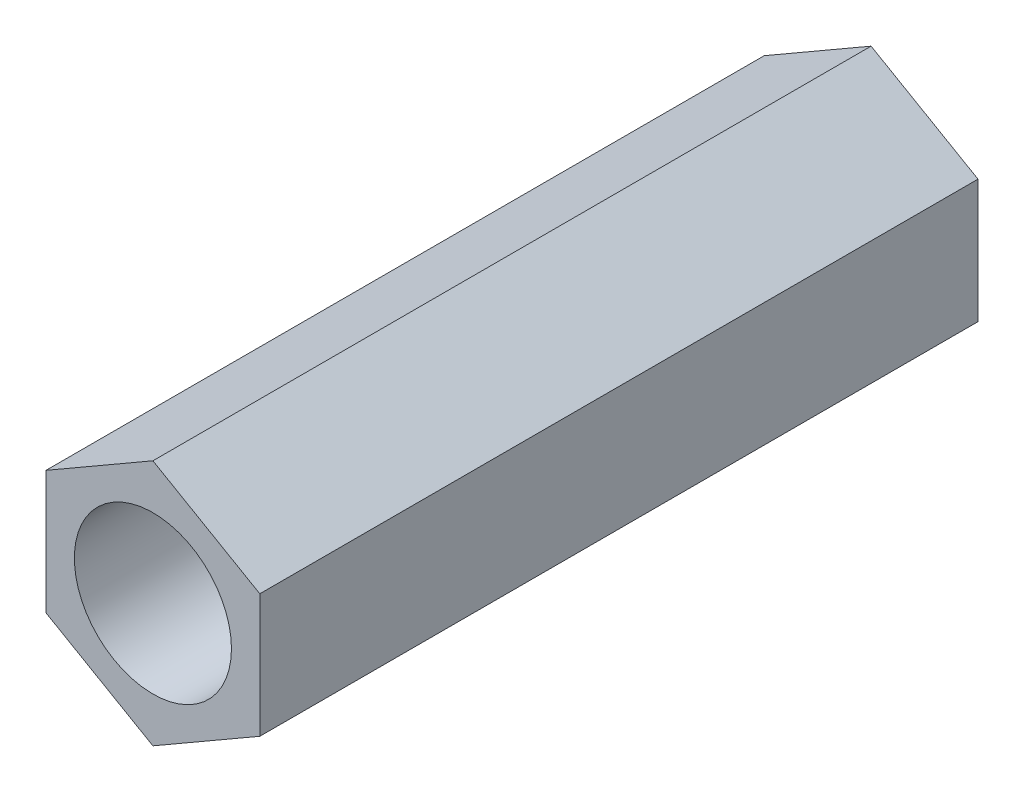
ISO-10303-21;
HEADER;
FILE_DESCRIPTION(('STEP AP214'),'2;1');
FILE_NAME('part.step','',(''),(''),'','','');
FILE_SCHEMA(('AUTOMOTIVE_DESIGN { 1 0 10303 214 1 1 1 1 }'));
ENDSEC;
DATA;
#1=APPLICATION_CONTEXT('core data for automotive mechanical design processes');
#2=APPLICATION_PROTOCOL_DEFINITION('international standard','automotive_design',2000,#1);
#3=PRODUCT_CONTEXT('',#1,'mechanical');
#4=PRODUCT('Part','Part','',(#3));
#5=PRODUCT_RELATED_PRODUCT_CATEGORY('part','',(#4));
#6=PRODUCT_DEFINITION_FORMATION('','',#4);
#7=PRODUCT_DEFINITION_CONTEXT('part definition',#1,'design');
#8=PRODUCT_DEFINITION('design','',#6,#7);
#9=PRODUCT_DEFINITION_SHAPE('','',#8);
#10=(LENGTH_UNIT() NAMED_UNIT(*) SI_UNIT(.MILLI.,.METRE.));
#11=(NAMED_UNIT(*) PLANE_ANGLE_UNIT() SI_UNIT($,.RADIAN.));
#12=(NAMED_UNIT(*) SI_UNIT($,.STERADIAN.) SOLID_ANGLE_UNIT());
#13=UNCERTAINTY_MEASURE_WITH_UNIT(LENGTH_MEASURE(1.E-05),#10,'distance_accuracy_value','');
#14=(GEOMETRIC_REPRESENTATION_CONTEXT(3) GLOBAL_UNCERTAINTY_ASSIGNED_CONTEXT((#13)) GLOBAL_UNIT_ASSIGNED_CONTEXT((#10,
#11,#12)) REPRESENTATION_CONTEXT('',''));
#15=CARTESIAN_POINT('',(0.,0.,0.));
#16=DIRECTION('',(0.,0.,1.));
#17=DIRECTION('',(1.,0.,0.));
#18=AXIS2_PLACEMENT_3D('',#15,#16,#17);
#19=CARTESIAN_POINT('',(2.38156986040719,1.37500000000003,16.));
#20=DIRECTION('',(-0.499999999999995,-0.866025403784442,0.));
#21=DIRECTION('',(0.866025403784442,-0.499999999999995,0.));
#22=AXIS2_PLACEMENT_3D('',#19,#20,#21);
#23=PLANE('',#22);
#24=DIRECTION('',(-0.866025403784442,0.499999999999995,0.));
#25=VECTOR('',#24,1.);
#26=CARTESIAN_POINT('',(2.38156986040719,1.37500000000003,0.));
#27=LINE('',#26,#25);
#28=CARTESIAN_POINT('',(2.38156986040719,1.37500000000003,0.));
#29=VERTEX_POINT('',#28);
#30=CARTESIAN_POINT('',(0.,2.75,0.));
#31=VERTEX_POINT('',#30);
#32=EDGE_CURVE('E115',#29,#31,#27,.T.);
#33=ORIENTED_EDGE('',*,*,#32,.T.);
#34=DIRECTION('',(0.,0.,-1.));
#35=VECTOR('',#34,1.);
#36=CARTESIAN_POINT('',(0.,2.75,16.));
#37=LINE('',#36,#35);
#38=CARTESIAN_POINT('',(0.,2.75,16.));
#39=VERTEX_POINT('',#38);
#40=EDGE_CURVE('E11',#39,#31,#37,.T.);
#41=ORIENTED_EDGE('',*,*,#40,.F.);
#42=DIRECTION('',(-0.866025403784442,0.499999999999995,0.));
#43=VECTOR('',#42,1.);
#44=CARTESIAN_POINT('',(2.38156986040719,1.37500000000003,16.));
#45=LINE('',#44,#43);
#46=CARTESIAN_POINT('',(2.38156986040719,1.37500000000003,16.));
#47=VERTEX_POINT('',#46);
#48=EDGE_CURVE('E126',#47,#39,#45,.T.);
#49=ORIENTED_EDGE('',*,*,#48,.F.);
#50=DIRECTION('',(0.,0.,-1.));
#51=VECTOR('',#50,1.);
#52=CARTESIAN_POINT('',(2.38156986040719,1.37500000000003,16.));
#53=LINE('',#52,#51);
#54=EDGE_CURVE('E111',#47,#29,#53,.T.);
#55=ORIENTED_EDGE('',*,*,#54,.T.);
#56=EDGE_LOOP('',(#33,#41,#49,#55));
#57=FACE_BOUND('',#56,.T.);
#58=ADVANCED_FACE('F31',(#57),#23,.F.);
#59=CARTESIAN_POINT('',(0.,2.75,16.));
#60=DIRECTION('',(0.500000000000001,-0.866025403784438,0.));
#61=DIRECTION('',(0.866025403784438,0.500000000000001,0.));
#62=AXIS2_PLACEMENT_3D('',#59,#60,#61);
#63=PLANE('',#62);
#64=DIRECTION('',(-0.866025403784438,-0.500000000000001,0.));
#65=VECTOR('',#64,1.);
#66=CARTESIAN_POINT('',(0.,2.75,0.));
#67=LINE('',#66,#65);
#68=CARTESIAN_POINT('',(-2.38156986040721,1.37499999999999,0.));
#69=VERTEX_POINT('',#68);
#70=EDGE_CURVE('E118',#31,#69,#67,.T.);
#71=ORIENTED_EDGE('',*,*,#70,.T.);
#72=DIRECTION('',(0.,0.,-1.));
#73=VECTOR('',#72,1.);
#74=CARTESIAN_POINT('',(-2.38156986040721,1.37499999999999,16.));
#75=LINE('',#74,#73);
#76=CARTESIAN_POINT('',(-2.38156986040721,1.37499999999999,16.));
#77=VERTEX_POINT('',#76);
#78=EDGE_CURVE('E39',#77,#69,#75,.T.);
#79=ORIENTED_EDGE('',*,*,#78,.F.);
#80=DIRECTION('',(-0.866025403784438,-0.500000000000001,0.));
#81=VECTOR('',#80,1.);
#82=CARTESIAN_POINT('',(0.,2.75,16.));
#83=LINE('',#82,#81);
#84=EDGE_CURVE('E84',#39,#77,#83,.T.);
#85=ORIENTED_EDGE('',*,*,#84,.F.);
#86=ORIENTED_EDGE('',*,*,#40,.T.);
#87=EDGE_LOOP('',(#71,#79,#85,#86));
#88=FACE_BOUND('',#87,.T.);
#89=ADVANCED_FACE('F151',(#88),#63,.F.);
#90=CARTESIAN_POINT('',(-2.38156986040721,1.37499999999999,16.));
#91=DIRECTION('',(1.,0.,0.));
#92=DIRECTION('',(0.,1.,0.));
#93=AXIS2_PLACEMENT_3D('',#90,#91,#92);
#94=PLANE('',#93);
#95=DIRECTION('',(0.,-1.,0.));
#96=VECTOR('',#95,1.);
#97=CARTESIAN_POINT('',(-2.38156986040721,1.37499999999999,0.));
#98=LINE('',#97,#96);
#99=CARTESIAN_POINT('',(-2.3815698604072,-1.37500000000001,0.));
#100=VERTEX_POINT('',#99);
#101=EDGE_CURVE('E121',#69,#100,#98,.T.);
#102=ORIENTED_EDGE('',*,*,#101,.T.);
#103=DIRECTION('',(0.,0.,-1.));
#104=VECTOR('',#103,1.);
#105=CARTESIAN_POINT('',(-2.3815698604072,-1.37500000000001,16.));
#106=LINE('',#105,#104);
#107=CARTESIAN_POINT('',(-2.3815698604072,-1.37500000000001,16.));
#108=VERTEX_POINT('',#107);
#109=EDGE_CURVE('E106',#108,#100,#106,.T.);
#110=ORIENTED_EDGE('',*,*,#109,.F.);
#111=DIRECTION('',(0.,-1.,0.));
#112=VECTOR('',#111,1.);
#113=CARTESIAN_POINT('',(-2.38156986040721,1.37499999999999,16.));
#114=LINE('',#113,#112);
#115=EDGE_CURVE('E97',#77,#108,#114,.T.);
#116=ORIENTED_EDGE('',*,*,#115,.F.);
#117=ORIENTED_EDGE('',*,*,#78,.T.);
#118=EDGE_LOOP('',(#102,#110,#116,#117));
#119=FACE_BOUND('',#118,.T.);
#120=ADVANCED_FACE('F132',(#119),#94,.F.);
#121=CARTESIAN_POINT('',(-2.3815698604072,-1.37500000000001,16.));
#122=DIRECTION('',(0.499999999999995,0.866025403784441,0.));
#123=DIRECTION('',(-0.866025403784442,0.499999999999995,0.));
#124=AXIS2_PLACEMENT_3D('',#121,#122,#123);
#125=PLANE('',#124);
#126=DIRECTION('',(0.866025403784441,-0.499999999999995,0.));
#127=VECTOR('',#126,1.);
#128=CARTESIAN_POINT('',(-2.3815698604072,-1.37500000000001,0.));
#129=LINE('',#128,#127);
#130=CARTESIAN_POINT('',(0.,-2.75,0.));
#131=VERTEX_POINT('',#130);
#132=EDGE_CURVE('E105',#100,#131,#129,.T.);
#133=ORIENTED_EDGE('',*,*,#132,.T.);
#134=DIRECTION('',(0.,0.,-1.));
#135=VECTOR('',#134,1.);
#136=CARTESIAN_POINT('',(0.,-2.75,16.));
#137=LINE('',#136,#135);
#138=CARTESIAN_POINT('',(0.,-2.75,16.));
#139=VERTEX_POINT('',#138);
#140=EDGE_CURVE('E102',#139,#131,#137,.T.);
#141=ORIENTED_EDGE('',*,*,#140,.F.);
#142=DIRECTION('',(0.866025403784441,-0.499999999999995,0.));
#143=VECTOR('',#142,1.);
#144=CARTESIAN_POINT('',(-2.3815698604072,-1.37500000000001,16.));
#145=LINE('',#144,#143);
#146=EDGE_CURVE('E91',#108,#139,#145,.T.);
#147=ORIENTED_EDGE('',*,*,#146,.F.);
#148=ORIENTED_EDGE('',*,*,#109,.T.);
#149=EDGE_LOOP('',(#133,#141,#147,#148));
#150=FACE_BOUND('',#149,.T.);
#151=ADVANCED_FACE('F103',(#150),#125,.F.);
#152=CARTESIAN_POINT('',(0.,-2.75,16.));
#153=DIRECTION('',(-0.500000000000007,0.866025403784435,0.));
#154=DIRECTION('',(-0.866025403784434,-0.500000000000007,0.));
#155=AXIS2_PLACEMENT_3D('',#152,#153,#154);
#156=PLANE('',#155);
#157=DIRECTION('',(0.866025403784434,0.500000000000007,0.));
#158=VECTOR('',#157,1.);
#159=CARTESIAN_POINT('',(0.,-2.75,0.));
#160=LINE('',#159,#158);
#161=CARTESIAN_POINT('',(2.38156986040722,-1.37499999999998,0.));
#162=VERTEX_POINT('',#161);
#163=EDGE_CURVE('E70',#131,#162,#160,.T.);
#164=ORIENTED_EDGE('',*,*,#163,.T.);
#165=DIRECTION('',(0.,0.,-1.));
#166=VECTOR('',#165,1.);
#167=CARTESIAN_POINT('',(2.38156986040722,-1.37499999999998,16.));
#168=LINE('',#167,#166);
#169=CARTESIAN_POINT('',(2.38156986040722,-1.37499999999998,16.));
#170=VERTEX_POINT('',#169);
#171=EDGE_CURVE('E107',#170,#162,#168,.T.);
#172=ORIENTED_EDGE('',*,*,#171,.F.);
#173=DIRECTION('',(0.866025403784434,0.500000000000007,0.));
#174=VECTOR('',#173,1.);
#175=CARTESIAN_POINT('',(0.,-2.75,16.));
#176=LINE('',#175,#174);
#177=EDGE_CURVE('E95',#139,#170,#176,.T.);
#178=ORIENTED_EDGE('',*,*,#177,.F.);
#179=ORIENTED_EDGE('',*,*,#140,.T.);
#180=EDGE_LOOP('',(#164,#172,#178,#179));
#181=FACE_BOUND('',#180,.T.);
#182=ADVANCED_FACE('F109',(#181),#156,.F.);
#183=CARTESIAN_POINT('',(2.38156986040722,-1.37499999999998,16.));
#184=DIRECTION('',(-1.,0.,0.));
#185=DIRECTION('',(0.,-1.,0.));
#186=AXIS2_PLACEMENT_3D('',#183,#184,#185);
#187=PLANE('',#186);
#188=DIRECTION('',(0.,1.,0.));
#189=VECTOR('',#188,1.);
#190=CARTESIAN_POINT('',(2.38156986040722,-1.37499999999998,0.));
#191=LINE('',#190,#189);
#192=EDGE_CURVE('E76',#162,#29,#191,.T.);
#193=ORIENTED_EDGE('',*,*,#192,.T.);
#194=ORIENTED_EDGE('',*,*,#54,.F.);
#195=DIRECTION('',(0.,1.,0.));
#196=VECTOR('',#195,1.);
#197=CARTESIAN_POINT('',(2.38156986040722,-1.37499999999998,16.));
#198=LINE('',#197,#196);
#199=EDGE_CURVE('E47',#170,#47,#198,.T.);
#200=ORIENTED_EDGE('',*,*,#199,.F.);
#201=ORIENTED_EDGE('',*,*,#171,.T.);
#202=EDGE_LOOP('',(#193,#194,#200,#201));
#203=FACE_BOUND('',#202,.T.);
#204=ADVANCED_FACE('F139',(#203),#187,.F.);
#205=CARTESIAN_POINT('',(0.,2.75,16.));
#206=DIRECTION('',(0.,0.,1.));
#207=DIRECTION('',(1.,0.,0.));
#208=AXIS2_PLACEMENT_3D('',#205,#206,#207);
#209=PLANE('',#208);
#210=CARTESIAN_POINT('',(0.,0.,16.));
#211=DIRECTION('',(0.,0.,1.));
#212=DIRECTION('',(1.,0.,0.));
#213=AXIS2_PLACEMENT_3D('',#210,#211,#212);
#214=CIRCLE('',#213,1.75);
#215=CARTESIAN_POINT('',(1.75,0.,16.));
#216=VERTEX_POINT('',#215);
#217=EDGE_CURVE('E206',#216,#216,#214,.T.);
#218=ORIENTED_EDGE('',*,*,#217,.F.);
#219=EDGE_LOOP('',(#218));
#220=FACE_BOUND('',#219,.T.);
#221=ORIENTED_EDGE('',*,*,#48,.T.);
#222=ORIENTED_EDGE('',*,*,#84,.T.);
#223=ORIENTED_EDGE('',*,*,#115,.T.);
#224=ORIENTED_EDGE('',*,*,#146,.T.);
#225=ORIENTED_EDGE('',*,*,#177,.T.);
#226=ORIENTED_EDGE('',*,*,#199,.T.);
#227=EDGE_LOOP('',(#221,#222,#223,#224,#225,#226));
#228=FACE_BOUND('',#227,.T.);
#229=ADVANCED_FACE('F93',(#220,#228),#209,.T.);
#230=CARTESIAN_POINT('',(0.,2.75,0.));
#231=DIRECTION('',(0.,0.,1.));
#232=DIRECTION('',(1.,0.,0.));
#233=AXIS2_PLACEMENT_3D('',#230,#231,#232);
#234=PLANE('',#233);
#235=CARTESIAN_POINT('',(0.,0.,0.));
#236=DIRECTION('',(0.,0.,1.));
#237=DIRECTION('',(1.,0.,0.));
#238=AXIS2_PLACEMENT_3D('',#235,#236,#237);
#239=CIRCLE('',#238,1.75);
#240=CARTESIAN_POINT('',(1.75,0.,0.));
#241=VERTEX_POINT('',#240);
#242=EDGE_CURVE('E119',#241,#241,#239,.T.);
#243=ORIENTED_EDGE('',*,*,#242,.T.);
#244=EDGE_LOOP('',(#243));
#245=FACE_BOUND('',#244,.T.);
#246=ORIENTED_EDGE('',*,*,#32,.F.);
#247=ORIENTED_EDGE('',*,*,#192,.F.);
#248=ORIENTED_EDGE('',*,*,#163,.F.);
#249=ORIENTED_EDGE('',*,*,#132,.F.);
#250=ORIENTED_EDGE('',*,*,#101,.F.);
#251=ORIENTED_EDGE('',*,*,#70,.F.);
#252=EDGE_LOOP('',(#246,#247,#248,#249,#250,#251));
#253=FACE_BOUND('',#252,.T.);
#254=ADVANCED_FACE('F135',(#245,#253),#234,.F.);
#255=CARTESIAN_POINT('',(0.,0.,0.));
#256=DIRECTION('',(0.,0.,1.));
#257=DIRECTION('',(1.,0.,0.));
#258=AXIS2_PLACEMENT_3D('',#255,#256,#257);
#259=CYLINDRICAL_SURFACE('',#258,1.75);
#260=ORIENTED_EDGE('',*,*,#242,.F.);
#261=EDGE_LOOP('',(#260));
#262=FACE_BOUND('',#261,.T.);
#263=ORIENTED_EDGE('',*,*,#217,.T.);
#264=EDGE_LOOP('',(#263));
#265=FACE_BOUND('',#264,.T.);
#266=ADVANCED_FACE('F188',(#262,#265),#259,.F.);
#267=CLOSED_SHELL('',(#58,#89,#120,#151,#182,#204,#229,#254,#266));
#268=MANIFOLD_SOLID_BREP('B2',#267);
#269=ADVANCED_BREP_SHAPE_REPRESENTATION('',(#18,#268),#14);
#270=SHAPE_DEFINITION_REPRESENTATION(#9,#269);
ENDSEC;
END-ISO-10303-21;
